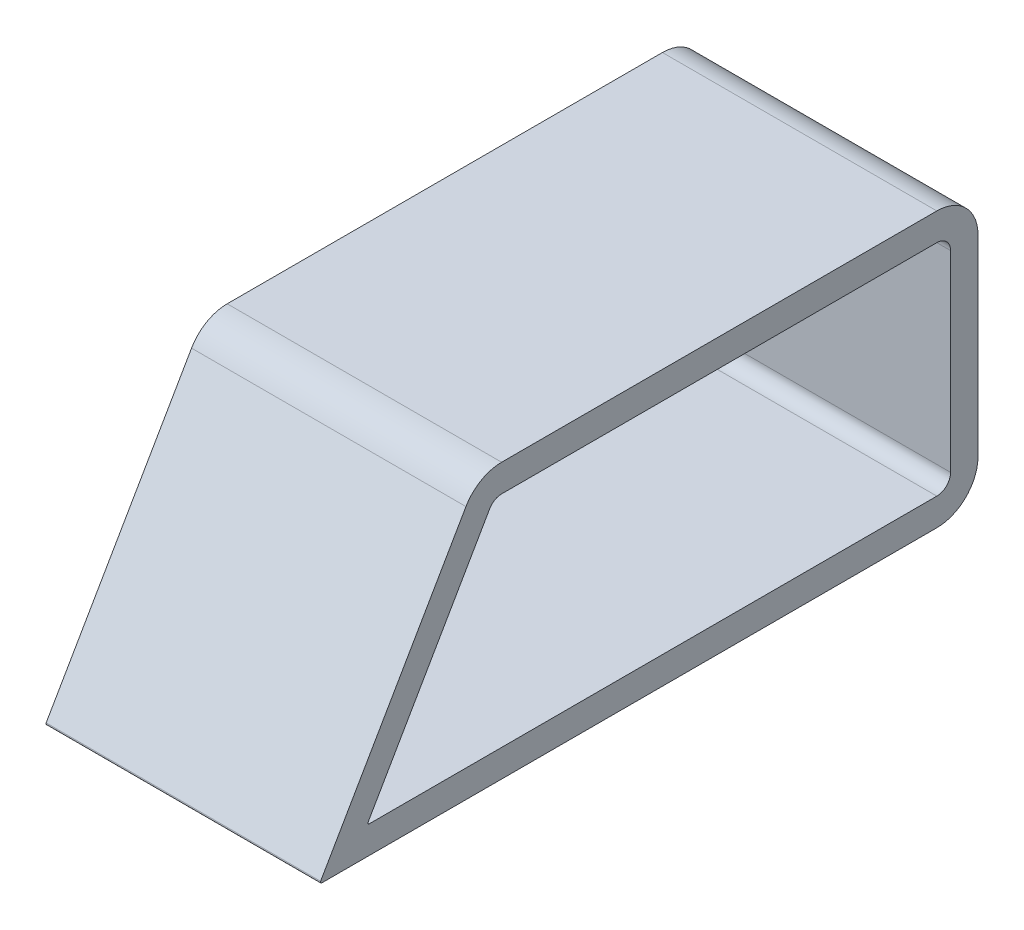
ISO-10303-21;
HEADER;
FILE_DESCRIPTION(('STEP AP214'),'2;1');
FILE_NAME('part.step','',(''),(''),'','','');
FILE_SCHEMA(('AUTOMOTIVE_DESIGN { 1 0 10303 214 1 1 1 1 }'));
ENDSEC;
DATA;
#1=APPLICATION_CONTEXT('core data for automotive mechanical design processes');
#2=APPLICATION_PROTOCOL_DEFINITION('international standard','automotive_design',2000,#1);
#3=PRODUCT_CONTEXT('',#1,'mechanical');
#4=PRODUCT('Part','Part','',(#3));
#5=PRODUCT_RELATED_PRODUCT_CATEGORY('part','',(#4));
#6=PRODUCT_DEFINITION_FORMATION('','',#4);
#7=PRODUCT_DEFINITION_CONTEXT('part definition',#1,'design');
#8=PRODUCT_DEFINITION('design','',#6,#7);
#9=PRODUCT_DEFINITION_SHAPE('','',#8);
#10=(LENGTH_UNIT() NAMED_UNIT(*) SI_UNIT(.MILLI.,.METRE.));
#11=(NAMED_UNIT(*) PLANE_ANGLE_UNIT() SI_UNIT($,.RADIAN.));
#12=(NAMED_UNIT(*) SI_UNIT($,.STERADIAN.) SOLID_ANGLE_UNIT());
#13=UNCERTAINTY_MEASURE_WITH_UNIT(LENGTH_MEASURE(1.E-05),#10,'distance_accuracy_value','');
#14=(GEOMETRIC_REPRESENTATION_CONTEXT(3) GLOBAL_UNCERTAINTY_ASSIGNED_CONTEXT((#13)) GLOBAL_UNIT_ASSIGNED_CONTEXT((#10,
#11,#12)) REPRESENTATION_CONTEXT('',''));
#15=CARTESIAN_POINT('',(0.,0.,0.));
#16=DIRECTION('',(0.,0.,1.));
#17=DIRECTION('',(1.,0.,0.));
#18=AXIS2_PLACEMENT_3D('',#15,#16,#17);
#19=CARTESIAN_POINT('',(254.,431.8,-337.288027260582));
#20=DIRECTION('',(-1.,0.,0.));
#21=DIRECTION('',(0.,0.,1.));
#22=AXIS2_PLACEMENT_3D('',#19,#20,#21);
#23=PLANE('',#22);
#24=DIRECTION('',(0.,-0.866025403784436,0.500000000000004));
#25=VECTOR('',#24,1.);
#26=CARTESIAN_POINT('',(254.,0.,0.));
#27=LINE('',#26,#25);
#28=CARTESIAN_POINT('',(254.,469.9,-271.296891492208));
#29=VERTEX_POINT('',#28);
#30=CARTESIAN_POINT('',(254.,3.81000000000009,-2.19970452561255));
#31=VERTEX_POINT('',#30);
#32=EDGE_CURVE('E263',#29,#31,#27,.T.);
#33=ORIENTED_EDGE('',*,*,#32,.T.);
#34=CARTESIAN_POINT('',(254.,2.54,-4.39940905122516));
#35=DIRECTION('',(-1.,0.,0.));
#36=DIRECTION('',(0.,0.,1.));
#37=AXIS2_PLACEMENT_3D('',#34,#35,#36);
#38=CIRCLE('',#37,2.54);
#39=CARTESIAN_POINT('',(254.,0.,-4.39940905122516));
#40=VERTEX_POINT('',#39);
#41=EDGE_CURVE('E323',#31,#40,#38,.F.);
#42=ORIENTED_EDGE('',*,*,#41,.T.);
#43=DIRECTION('',(0.,0.,-1.));
#44=VECTOR('',#43,1.);
#45=CARTESIAN_POINT('',(254.,0.,-1143.));
#46=LINE('',#45,#44);
#47=CARTESIAN_POINT('',(254.,-1.2490009027033E-13,-1143.));
#48=VERTEX_POINT('',#47);
#49=EDGE_CURVE('E244',#40,#48,#46,.T.);
#50=ORIENTED_EDGE('',*,*,#49,.T.);
#51=CARTESIAN_POINT('',(254.,76.2,-1143.));
#52=DIRECTION('',(1.,0.,0.));
#53=DIRECTION('',(0.,0.,1.));
#54=AXIS2_PLACEMENT_3D('',#51,#52,#53);
#55=CIRCLE('',#54,76.2000000000001);
#56=CARTESIAN_POINT('',(254.,76.2,-1219.2));
#57=VERTEX_POINT('',#56);
#58=EDGE_CURVE('E247',#48,#57,#55,.T.);
#59=ORIENTED_EDGE('',*,*,#58,.T.);
#60=DIRECTION('',(0.,1.,0.));
#61=VECTOR('',#60,1.);
#62=CARTESIAN_POINT('',(254.,431.8,-1219.2));
#63=LINE('',#62,#61);
#64=CARTESIAN_POINT('',(254.,431.8,-1219.2));
#65=VERTEX_POINT('',#64);
#66=EDGE_CURVE('E251',#57,#65,#63,.T.);
#67=ORIENTED_EDGE('',*,*,#66,.T.);
#68=CARTESIAN_POINT('',(254.,431.8,-1143.));
#69=DIRECTION('',(1.,0.,0.));
#70=DIRECTION('',(0.,0.,1.));
#71=AXIS2_PLACEMENT_3D('',#68,#69,#70);
#72=CIRCLE('',#71,76.2000000000001);
#73=CARTESIAN_POINT('',(254.,508.,-1143.));
#74=VERTEX_POINT('',#73);
#75=EDGE_CURVE('E254',#65,#74,#72,.T.);
#76=ORIENTED_EDGE('',*,*,#75,.T.);
#77=DIRECTION('',(0.,0.,1.));
#78=VECTOR('',#77,1.);
#79=CARTESIAN_POINT('',(254.,508.,-337.288027260582));
#80=LINE('',#79,#78);
#81=CARTESIAN_POINT('',(254.,508.,-337.288027260582));
#82=VERTEX_POINT('',#81);
#83=EDGE_CURVE('E257',#74,#82,#80,.T.);
#84=ORIENTED_EDGE('',*,*,#83,.T.);
#85=CARTESIAN_POINT('',(254.,431.8,-337.288027260582));
#86=DIRECTION('',(1.,0.,0.));
#87=DIRECTION('',(0.,0.,1.));
#88=AXIS2_PLACEMENT_3D('',#85,#86,#87);
#89=CIRCLE('',#88,76.1999999999999);
#90=EDGE_CURVE('E260',#82,#29,#89,.T.);
#91=ORIENTED_EDGE('',*,*,#90,.T.);
#92=EDGE_LOOP('',(#33,#42,#50,#59,#67,#76,#84,#91));
#93=FACE_BOUND('',#92,.T.);
#94=CARTESIAN_POINT('',(254.,431.8,-337.288027260582));
#95=DIRECTION('',(1.,0.,0.));
#96=DIRECTION('',(0.,0.,1.));
#97=AXIS2_PLACEMENT_3D('',#94,#95,#96);
#98=CIRCLE('',#97,25.4);
#99=CARTESIAN_POINT('',(254.,457.2,-337.288027260582));
#100=VERTEX_POINT('',#99);
#101=CARTESIAN_POINT('',(254.,444.5,-315.290982004457));
#102=VERTEX_POINT('',#101);
#103=EDGE_CURVE('E161',#100,#102,#98,.T.);
#104=ORIENTED_EDGE('',*,*,#103,.F.);
#105=DIRECTION('',(0.,0.,1.));
#106=VECTOR('',#105,1.);
#107=CARTESIAN_POINT('',(254.,457.2,-337.288027260582));
#108=LINE('',#107,#106);
#109=CARTESIAN_POINT('',(254.,457.2,-1143.));
#110=VERTEX_POINT('',#109);
#111=EDGE_CURVE('E204',#110,#100,#108,.T.);
#112=ORIENTED_EDGE('',*,*,#111,.F.);
#113=CARTESIAN_POINT('',(254.,431.8,-1143.));
#114=DIRECTION('',(1.,0.,0.));
#115=DIRECTION('',(0.,0.,1.));
#116=AXIS2_PLACEMENT_3D('',#113,#114,#115);
#117=CIRCLE('',#116,25.4);
#118=CARTESIAN_POINT('',(254.,431.8,-1168.4));
#119=VERTEX_POINT('',#118);
#120=EDGE_CURVE('E200',#119,#110,#117,.T.);
#121=ORIENTED_EDGE('',*,*,#120,.F.);
#122=DIRECTION('',(0.,1.,0.));
#123=VECTOR('',#122,1.);
#124=CARTESIAN_POINT('',(254.,431.8,-1168.4));
#125=LINE('',#124,#123);
#126=CARTESIAN_POINT('',(254.,76.2,-1168.4));
#127=VERTEX_POINT('',#126);
#128=EDGE_CURVE('E197',#127,#119,#125,.T.);
#129=ORIENTED_EDGE('',*,*,#128,.F.);
#130=CARTESIAN_POINT('',(254.,76.2,-1143.));
#131=DIRECTION('',(1.,0.,0.));
#132=DIRECTION('',(0.,0.,1.));
#133=AXIS2_PLACEMENT_3D('',#130,#131,#132);
#134=CIRCLE('',#133,25.4);
#135=CARTESIAN_POINT('',(254.,50.8,-1143.));
#136=VERTEX_POINT('',#135);
#137=EDGE_CURVE('E192',#136,#127,#134,.T.);
#138=ORIENTED_EDGE('',*,*,#137,.F.);
#139=DIRECTION('',(0.,0.,-1.));
#140=VECTOR('',#139,1.);
#141=CARTESIAN_POINT('',(254.,50.8,-1143.));
#142=LINE('',#141,#140);
#143=CARTESIAN_POINT('',(254.,50.8,-92.3875900757238));
#144=VERTEX_POINT('',#143);
#145=EDGE_CURVE('E189',#144,#136,#142,.T.);
#146=ORIENTED_EDGE('',*,*,#145,.F.);
#147=CARTESIAN_POINT('',(254.,53.34,-92.3875900757239));
#148=DIRECTION('',(-1.,0.,0.));
#149=DIRECTION('',(0.,0.,1.));
#150=AXIS2_PLACEMENT_3D('',#147,#148,#149);
#151=CIRCLE('',#150,2.54);
#152=CARTESIAN_POINT('',(254.,54.61,-90.1878855501115));
#153=VERTEX_POINT('',#152);
#154=EDGE_CURVE('E11',#144,#153,#151,.T.);
#155=ORIENTED_EDGE('',*,*,#154,.T.);
#156=DIRECTION('',(0.,-0.866025403784436,0.500000000000005));
#157=VECTOR('',#156,1.);
#158=CARTESIAN_POINT('',(254.,50.8,-87.988181024499));
#159=LINE('',#158,#157);
#160=EDGE_CURVE('E172',#102,#153,#159,.T.);
#161=ORIENTED_EDGE('',*,*,#160,.F.);
#162=EDGE_LOOP('',(#104,#112,#121,#129,#138,#146,#155,#161));
#163=FACE_BOUND('',#162,.T.);
#164=ADVANCED_FACE('F45',(#93,#163),#23,.F.);
#165=CARTESIAN_POINT('',(-254.,431.8,-337.288027260582));
#166=DIRECTION('',(-1.,0.,0.));
#167=DIRECTION('',(0.,0.,1.));
#168=AXIS2_PLACEMENT_3D('',#165,#166,#167);
#169=PLANE('',#168);
#170=DIRECTION('',(0.,0.,-1.));
#171=VECTOR('',#170,1.);
#172=CARTESIAN_POINT('',(-254.,0.,-1143.));
#173=LINE('',#172,#171);
#174=CARTESIAN_POINT('',(-254.,0.,-4.39940905122516));
#175=VERTEX_POINT('',#174);
#176=CARTESIAN_POINT('',(-254.,-1.2490009027033E-13,-1143.));
#177=VERTEX_POINT('',#176);
#178=EDGE_CURVE('E183',#175,#177,#173,.T.);
#179=ORIENTED_EDGE('',*,*,#178,.F.);
#180=CARTESIAN_POINT('',(-254.,2.54,-4.39940905122516));
#181=DIRECTION('',(-1.,0.,0.));
#182=DIRECTION('',(0.,0.,1.));
#183=AXIS2_PLACEMENT_3D('',#180,#181,#182);
#184=CIRCLE('',#183,2.54);
#185=CARTESIAN_POINT('',(-254.,3.81000000000009,-2.19970452561255));
#186=VERTEX_POINT('',#185);
#187=EDGE_CURVE('E69',#175,#186,#184,.T.);
#188=ORIENTED_EDGE('',*,*,#187,.T.);
#189=DIRECTION('',(0.,-0.866025403784436,0.500000000000004));
#190=VECTOR('',#189,1.);
#191=CARTESIAN_POINT('',(-254.,0.,0.));
#192=LINE('',#191,#190);
#193=CARTESIAN_POINT('',(-254.,469.9,-271.296891492208));
#194=VERTEX_POINT('',#193);
#195=EDGE_CURVE('E248',#194,#186,#192,.T.);
#196=ORIENTED_EDGE('',*,*,#195,.F.);
#197=CARTESIAN_POINT('',(-254.,431.8,-337.288027260582));
#198=DIRECTION('',(1.,0.,0.));
#199=DIRECTION('',(0.,0.,1.));
#200=AXIS2_PLACEMENT_3D('',#197,#198,#199);
#201=CIRCLE('',#200,76.1999999999999);
#202=CARTESIAN_POINT('',(-254.,508.,-337.288027260582));
#203=VERTEX_POINT('',#202);
#204=EDGE_CURVE('E281',#203,#194,#201,.T.);
#205=ORIENTED_EDGE('',*,*,#204,.F.);
#206=DIRECTION('',(0.,0.,1.));
#207=VECTOR('',#206,1.);
#208=CARTESIAN_POINT('',(-254.,508.,-337.288027260582));
#209=LINE('',#208,#207);
#210=CARTESIAN_POINT('',(-254.,508.,-1143.));
#211=VERTEX_POINT('',#210);
#212=EDGE_CURVE('E278',#211,#203,#209,.T.);
#213=ORIENTED_EDGE('',*,*,#212,.F.);
#214=CARTESIAN_POINT('',(-254.,431.8,-1143.));
#215=DIRECTION('',(1.,0.,0.));
#216=DIRECTION('',(0.,0.,1.));
#217=AXIS2_PLACEMENT_3D('',#214,#215,#216);
#218=CIRCLE('',#217,76.2000000000001);
#219=CARTESIAN_POINT('',(-254.,431.8,-1219.2));
#220=VERTEX_POINT('',#219);
#221=EDGE_CURVE('E275',#220,#211,#218,.T.);
#222=ORIENTED_EDGE('',*,*,#221,.F.);
#223=DIRECTION('',(0.,1.,0.));
#224=VECTOR('',#223,1.);
#225=CARTESIAN_POINT('',(-254.,431.8,-1219.2));
#226=LINE('',#225,#224);
#227=CARTESIAN_POINT('',(-254.,76.2,-1219.2));
#228=VERTEX_POINT('',#227);
#229=EDGE_CURVE('E272',#228,#220,#226,.T.);
#230=ORIENTED_EDGE('',*,*,#229,.F.);
#231=CARTESIAN_POINT('',(-254.,76.2,-1143.));
#232=DIRECTION('',(1.,0.,0.));
#233=DIRECTION('',(0.,0.,1.));
#234=AXIS2_PLACEMENT_3D('',#231,#232,#233);
#235=CIRCLE('',#234,76.2000000000001);
#236=EDGE_CURVE('E269',#177,#228,#235,.T.);
#237=ORIENTED_EDGE('',*,*,#236,.F.);
#238=EDGE_LOOP('',(#179,#188,#196,#205,#213,#222,#230,#237));
#239=FACE_BOUND('',#238,.T.);
#240=DIRECTION('',(0.,0.,1.));
#241=VECTOR('',#240,1.);
#242=CARTESIAN_POINT('',(-254.,457.2,-337.288027260582));
#243=LINE('',#242,#241);
#244=CARTESIAN_POINT('',(-254.,457.2,-1143.));
#245=VERTEX_POINT('',#244);
#246=CARTESIAN_POINT('',(-254.,457.2,-337.288027260582));
#247=VERTEX_POINT('',#246);
#248=EDGE_CURVE('E173',#245,#247,#243,.T.);
#249=ORIENTED_EDGE('',*,*,#248,.T.);
#250=CARTESIAN_POINT('',(-254.,431.8,-337.288027260582));
#251=DIRECTION('',(1.,0.,0.));
#252=DIRECTION('',(0.,0.,1.));
#253=AXIS2_PLACEMENT_3D('',#250,#251,#252);
#254=CIRCLE('',#253,25.4);
#255=CARTESIAN_POINT('',(-254.,444.5,-315.290982004457));
#256=VERTEX_POINT('',#255);
#257=EDGE_CURVE('E207',#247,#256,#254,.T.);
#258=ORIENTED_EDGE('',*,*,#257,.T.);
#259=DIRECTION('',(0.,-0.866025403784436,0.500000000000005));
#260=VECTOR('',#259,1.);
#261=CARTESIAN_POINT('',(-254.,50.8,-87.988181024499));
#262=LINE('',#261,#260);
#263=CARTESIAN_POINT('',(-254.,54.61,-90.1878855501115));
#264=VERTEX_POINT('',#263);
#265=EDGE_CURVE('E181',#256,#264,#262,.T.);
#266=ORIENTED_EDGE('',*,*,#265,.T.);
#267=CARTESIAN_POINT('',(-254.,53.34,-92.3875900757239));
#268=DIRECTION('',(-1.,0.,0.));
#269=DIRECTION('',(0.,0.,1.));
#270=AXIS2_PLACEMENT_3D('',#267,#268,#269);
#271=CIRCLE('',#270,2.54);
#272=CARTESIAN_POINT('',(-254.,50.8,-92.3875900757238));
#273=VERTEX_POINT('',#272);
#274=EDGE_CURVE('E54',#264,#273,#271,.F.);
#275=ORIENTED_EDGE('',*,*,#274,.T.);
#276=DIRECTION('',(0.,0.,-1.));
#277=VECTOR('',#276,1.);
#278=CARTESIAN_POINT('',(-254.,50.8,-1143.));
#279=LINE('',#278,#277);
#280=CARTESIAN_POINT('',(-254.,50.8,-1143.));
#281=VERTEX_POINT('',#280);
#282=EDGE_CURVE('E212',#273,#281,#279,.T.);
#283=ORIENTED_EDGE('',*,*,#282,.T.);
#284=CARTESIAN_POINT('',(-254.,76.2,-1143.));
#285=DIRECTION('',(1.,0.,0.));
#286=DIRECTION('',(0.,0.,1.));
#287=AXIS2_PLACEMENT_3D('',#284,#285,#286);
#288=CIRCLE('',#287,25.4);
#289=CARTESIAN_POINT('',(-254.,76.2,-1168.4));
#290=VERTEX_POINT('',#289);
#291=EDGE_CURVE('E215',#281,#290,#288,.T.);
#292=ORIENTED_EDGE('',*,*,#291,.T.);
#293=DIRECTION('',(0.,1.,0.));
#294=VECTOR('',#293,1.);
#295=CARTESIAN_POINT('',(-254.,431.8,-1168.4));
#296=LINE('',#295,#294);
#297=CARTESIAN_POINT('',(-254.,431.8,-1168.4));
#298=VERTEX_POINT('',#297);
#299=EDGE_CURVE('E219',#290,#298,#296,.T.);
#300=ORIENTED_EDGE('',*,*,#299,.T.);
#301=CARTESIAN_POINT('',(-254.,431.8,-1143.));
#302=DIRECTION('',(1.,0.,0.));
#303=DIRECTION('',(0.,0.,1.));
#304=AXIS2_PLACEMENT_3D('',#301,#302,#303);
#305=CIRCLE('',#304,25.4);
#306=EDGE_CURVE('E223',#298,#245,#305,.T.);
#307=ORIENTED_EDGE('',*,*,#306,.T.);
#308=EDGE_LOOP('',(#249,#258,#266,#275,#283,#292,#300,#307));
#309=FACE_BOUND('',#308,.T.);
#310=ADVANCED_FACE('F328',(#239,#309),#169,.T.);
#311=CARTESIAN_POINT('',(254.,0.,-1143.));
#312=DIRECTION('',(0.,1.,0.));
#313=DIRECTION('',(0.,0.,1.));
#314=AXIS2_PLACEMENT_3D('',#311,#312,#313);
#315=PLANE('',#314);
#316=ORIENTED_EDGE('',*,*,#49,.F.);
#317=DIRECTION('',(-1.,0.,0.));
#318=VECTOR('',#317,1.);
#319=CARTESIAN_POINT('',(254.,0.,-4.39940905122516));
#320=LINE('',#319,#318);
#321=EDGE_CURVE('E315',#40,#175,#320,.T.);
#322=ORIENTED_EDGE('',*,*,#321,.T.);
#323=ORIENTED_EDGE('',*,*,#178,.T.);
#324=DIRECTION('',(-1.,0.,0.));
#325=VECTOR('',#324,1.);
#326=CARTESIAN_POINT('',(254.,-1.2490009027033E-13,-1143.));
#327=LINE('',#326,#325);
#328=EDGE_CURVE('E305',#48,#177,#327,.T.);
#329=ORIENTED_EDGE('',*,*,#328,.F.);
#330=EDGE_LOOP('',(#316,#322,#323,#329));
#331=FACE_BOUND('',#330,.T.);
#332=ADVANCED_FACE('F354',(#331),#315,.F.);
#333=CARTESIAN_POINT('',(254.,76.2,-1143.));
#334=DIRECTION('',(-1.,0.,0.));
#335=DIRECTION('',(0.,0.,1.));
#336=AXIS2_PLACEMENT_3D('',#333,#334,#335);
#337=CYLINDRICAL_SURFACE('',#336,76.2000000000001);
#338=ORIENTED_EDGE('',*,*,#236,.T.);
#339=DIRECTION('',(-1.,0.,0.));
#340=VECTOR('',#339,1.);
#341=CARTESIAN_POINT('',(254.,76.2,-1219.2));
#342=LINE('',#341,#340);
#343=EDGE_CURVE('E301',#57,#228,#342,.T.);
#344=ORIENTED_EDGE('',*,*,#343,.F.);
#345=ORIENTED_EDGE('',*,*,#58,.F.);
#346=ORIENTED_EDGE('',*,*,#328,.T.);
#347=EDGE_LOOP('',(#338,#344,#345,#346));
#348=FACE_BOUND('',#347,.T.);
#349=ADVANCED_FACE('F377',(#348),#337,.T.);
#350=CARTESIAN_POINT('',(254.,431.8,-1219.2));
#351=DIRECTION('',(0.,0.,1.));
#352=DIRECTION('',(1.,0.,0.));
#353=AXIS2_PLACEMENT_3D('',#350,#351,#352);
#354=PLANE('',#353);
#355=ORIENTED_EDGE('',*,*,#229,.T.);
#356=DIRECTION('',(-1.,0.,0.));
#357=VECTOR('',#356,1.);
#358=CARTESIAN_POINT('',(254.,431.8,-1219.2));
#359=LINE('',#358,#357);
#360=EDGE_CURVE('E297',#65,#220,#359,.T.);
#361=ORIENTED_EDGE('',*,*,#360,.F.);
#362=ORIENTED_EDGE('',*,*,#66,.F.);
#363=ORIENTED_EDGE('',*,*,#343,.T.);
#364=EDGE_LOOP('',(#355,#361,#362,#363));
#365=FACE_BOUND('',#364,.T.);
#366=ADVANCED_FACE('F373',(#365),#354,.F.);
#367=CARTESIAN_POINT('',(254.,431.8,-1143.));
#368=DIRECTION('',(-1.,0.,0.));
#369=DIRECTION('',(0.,0.,1.));
#370=AXIS2_PLACEMENT_3D('',#367,#368,#369);
#371=CYLINDRICAL_SURFACE('',#370,76.2000000000001);
#372=ORIENTED_EDGE('',*,*,#221,.T.);
#373=DIRECTION('',(-1.,0.,0.));
#374=VECTOR('',#373,1.);
#375=CARTESIAN_POINT('',(254.,508.,-1143.));
#376=LINE('',#375,#374);
#377=EDGE_CURVE('E293',#74,#211,#376,.T.);
#378=ORIENTED_EDGE('',*,*,#377,.F.);
#379=ORIENTED_EDGE('',*,*,#75,.F.);
#380=ORIENTED_EDGE('',*,*,#360,.T.);
#381=EDGE_LOOP('',(#372,#378,#379,#380));
#382=FACE_BOUND('',#381,.T.);
#383=ADVANCED_FACE('F369',(#382),#371,.T.);
#384=CARTESIAN_POINT('',(254.,508.,-337.288027260582));
#385=DIRECTION('',(0.,-1.,0.));
#386=DIRECTION('',(0.,0.,-1.));
#387=AXIS2_PLACEMENT_3D('',#384,#385,#386);
#388=PLANE('',#387);
#389=ORIENTED_EDGE('',*,*,#212,.T.);
#390=DIRECTION('',(-1.,0.,0.));
#391=VECTOR('',#390,1.);
#392=CARTESIAN_POINT('',(254.,508.,-337.288027260582));
#393=LINE('',#392,#391);
#394=EDGE_CURVE('E289',#82,#203,#393,.T.);
#395=ORIENTED_EDGE('',*,*,#394,.F.);
#396=ORIENTED_EDGE('',*,*,#83,.F.);
#397=ORIENTED_EDGE('',*,*,#377,.T.);
#398=EDGE_LOOP('',(#389,#395,#396,#397));
#399=FACE_BOUND('',#398,.T.);
#400=ADVANCED_FACE('F365',(#399),#388,.F.);
#401=CARTESIAN_POINT('',(254.,431.8,-337.288027260582));
#402=DIRECTION('',(-1.,0.,0.));
#403=DIRECTION('',(0.,0.,1.));
#404=AXIS2_PLACEMENT_3D('',#401,#402,#403);
#405=CYLINDRICAL_SURFACE('',#404,76.1999999999999);
#406=ORIENTED_EDGE('',*,*,#204,.T.);
#407=DIRECTION('',(-1.,0.,0.));
#408=VECTOR('',#407,1.);
#409=CARTESIAN_POINT('',(254.,469.9,-271.296891492208));
#410=LINE('',#409,#408);
#411=EDGE_CURVE('E266',#29,#194,#410,.T.);
#412=ORIENTED_EDGE('',*,*,#411,.F.);
#413=ORIENTED_EDGE('',*,*,#90,.F.);
#414=ORIENTED_EDGE('',*,*,#394,.T.);
#415=EDGE_LOOP('',(#406,#412,#413,#414));
#416=FACE_BOUND('',#415,.T.);
#417=ADVANCED_FACE('F362',(#416),#405,.T.);
#418=CARTESIAN_POINT('',(254.,0.,0.));
#419=DIRECTION('',(0.,-0.500000000000004,-0.866025403784436));
#420=DIRECTION('',(0.,0.866025403784436,-0.500000000000004));
#421=AXIS2_PLACEMENT_3D('',#418,#419,#420);
#422=PLANE('',#421);
#423=ORIENTED_EDGE('',*,*,#195,.T.);
#424=DIRECTION('',(-1.,0.,0.));
#425=VECTOR('',#424,1.);
#426=CARTESIAN_POINT('',(254.,3.81000000000009,-2.19970452561255));
#427=LINE('',#426,#425);
#428=EDGE_CURVE('E61',#186,#31,#427,.F.);
#429=ORIENTED_EDGE('',*,*,#428,.T.);
#430=ORIENTED_EDGE('',*,*,#32,.F.);
#431=ORIENTED_EDGE('',*,*,#411,.T.);
#432=EDGE_LOOP('',(#423,#429,#430,#431));
#433=FACE_BOUND('',#432,.T.);
#434=ADVANCED_FACE('F359',(#433),#422,.F.);
#435=CARTESIAN_POINT('',(254.,431.8,-337.288027260582));
#436=DIRECTION('',(-1.,0.,0.));
#437=DIRECTION('',(0.,0.,1.));
#438=AXIS2_PLACEMENT_3D('',#435,#436,#437);
#439=CYLINDRICAL_SURFACE('',#438,25.4);
#440=ORIENTED_EDGE('',*,*,#257,.F.);
#441=DIRECTION('',(-1.,0.,0.));
#442=VECTOR('',#441,1.);
#443=CARTESIAN_POINT('',(254.,457.2,-337.288027260582));
#444=LINE('',#443,#442);
#445=EDGE_CURVE('E167',#100,#247,#444,.T.);
#446=ORIENTED_EDGE('',*,*,#445,.F.);
#447=ORIENTED_EDGE('',*,*,#103,.T.);
#448=DIRECTION('',(-1.,0.,0.));
#449=VECTOR('',#448,1.);
#450=CARTESIAN_POINT('',(254.,444.5,-315.290982004457));
#451=LINE('',#450,#449);
#452=EDGE_CURVE('E164',#102,#256,#451,.T.);
#453=ORIENTED_EDGE('',*,*,#452,.T.);
#454=EDGE_LOOP('',(#440,#446,#447,#453));
#455=FACE_BOUND('',#454,.T.);
#456=ADVANCED_FACE('F163',(#455),#439,.F.);
#457=CARTESIAN_POINT('',(254.,50.8,-87.988181024499));
#458=DIRECTION('',(0.,-0.500000000000005,-0.866025403784436));
#459=DIRECTION('',(0.,0.866025403784436,-0.500000000000005));
#460=AXIS2_PLACEMENT_3D('',#457,#458,#459);
#461=PLANE('',#460);
#462=ORIENTED_EDGE('',*,*,#160,.T.);
#463=DIRECTION('',(-1.,0.,0.));
#464=VECTOR('',#463,1.);
#465=CARTESIAN_POINT('',(-254.,54.61,-90.1878855501115));
#466=LINE('',#465,#464);
#467=EDGE_CURVE('E309',#153,#264,#466,.T.);
#468=ORIENTED_EDGE('',*,*,#467,.T.);
#469=ORIENTED_EDGE('',*,*,#265,.F.);
#470=ORIENTED_EDGE('',*,*,#452,.F.);
#471=EDGE_LOOP('',(#462,#468,#469,#470));
#472=FACE_BOUND('',#471,.T.);
#473=ADVANCED_FACE('F177',(#472),#461,.T.);
#474=CARTESIAN_POINT('',(254.,50.8,-1143.));
#475=DIRECTION('',(0.,1.,0.));
#476=DIRECTION('',(0.,0.,1.));
#477=AXIS2_PLACEMENT_3D('',#474,#475,#476);
#478=PLANE('',#477);
#479=ORIENTED_EDGE('',*,*,#282,.F.);
#480=DIRECTION('',(-1.,0.,0.));
#481=VECTOR('',#480,1.);
#482=CARTESIAN_POINT('',(254.,50.8,-92.3875900757239));
#483=LINE('',#482,#481);
#484=EDGE_CURVE('E312',#273,#144,#483,.F.);
#485=ORIENTED_EDGE('',*,*,#484,.T.);
#486=ORIENTED_EDGE('',*,*,#145,.T.);
#487=DIRECTION('',(-1.,0.,0.));
#488=VECTOR('',#487,1.);
#489=CARTESIAN_POINT('',(254.,50.8,-1143.));
#490=LINE('',#489,#488);
#491=EDGE_CURVE('E184',#136,#281,#490,.T.);
#492=ORIENTED_EDGE('',*,*,#491,.T.);
#493=EDGE_LOOP('',(#479,#485,#486,#492));
#494=FACE_BOUND('',#493,.T.);
#495=ADVANCED_FACE('F332',(#494),#478,.T.);
#496=CARTESIAN_POINT('',(254.,76.2,-1143.));
#497=DIRECTION('',(-1.,0.,0.));
#498=DIRECTION('',(0.,0.,1.));
#499=AXIS2_PLACEMENT_3D('',#496,#497,#498);
#500=CYLINDRICAL_SURFACE('',#499,25.4);
#501=ORIENTED_EDGE('',*,*,#291,.F.);
#502=ORIENTED_EDGE('',*,*,#491,.F.);
#503=ORIENTED_EDGE('',*,*,#137,.T.);
#504=DIRECTION('',(-1.,0.,0.));
#505=VECTOR('',#504,1.);
#506=CARTESIAN_POINT('',(254.,76.2,-1168.4));
#507=LINE('',#506,#505);
#508=EDGE_CURVE('E238',#127,#290,#507,.T.);
#509=ORIENTED_EDGE('',*,*,#508,.T.);
#510=EDGE_LOOP('',(#501,#502,#503,#509));
#511=FACE_BOUND('',#510,.T.);
#512=ADVANCED_FACE('F425',(#511),#500,.F.);
#513=CARTESIAN_POINT('',(254.,431.8,-1168.4));
#514=DIRECTION('',(0.,0.,1.));
#515=DIRECTION('',(1.,0.,0.));
#516=AXIS2_PLACEMENT_3D('',#513,#514,#515);
#517=PLANE('',#516);
#518=ORIENTED_EDGE('',*,*,#299,.F.);
#519=ORIENTED_EDGE('',*,*,#508,.F.);
#520=ORIENTED_EDGE('',*,*,#128,.T.);
#521=DIRECTION('',(-1.,0.,0.));
#522=VECTOR('',#521,1.);
#523=CARTESIAN_POINT('',(254.,431.8,-1168.4));
#524=LINE('',#523,#522);
#525=EDGE_CURVE('E235',#119,#298,#524,.T.);
#526=ORIENTED_EDGE('',*,*,#525,.T.);
#527=EDGE_LOOP('',(#518,#519,#520,#526));
#528=FACE_BOUND('',#527,.T.);
#529=ADVANCED_FACE('F437',(#528),#517,.T.);
#530=CARTESIAN_POINT('',(254.,431.8,-1143.));
#531=DIRECTION('',(-1.,0.,0.));
#532=DIRECTION('',(0.,0.,1.));
#533=AXIS2_PLACEMENT_3D('',#530,#531,#532);
#534=CYLINDRICAL_SURFACE('',#533,25.4);
#535=ORIENTED_EDGE('',*,*,#306,.F.);
#536=ORIENTED_EDGE('',*,*,#525,.F.);
#537=ORIENTED_EDGE('',*,*,#120,.T.);
#538=DIRECTION('',(-1.,0.,0.));
#539=VECTOR('',#538,1.);
#540=CARTESIAN_POINT('',(254.,457.2,-1143.));
#541=LINE('',#540,#539);
#542=EDGE_CURVE('E232',#110,#245,#541,.T.);
#543=ORIENTED_EDGE('',*,*,#542,.T.);
#544=EDGE_LOOP('',(#535,#536,#537,#543));
#545=FACE_BOUND('',#544,.T.);
#546=ADVANCED_FACE('F344',(#545),#534,.F.);
#547=CARTESIAN_POINT('',(254.,457.2,-337.288027260582));
#548=DIRECTION('',(0.,-1.,0.));
#549=DIRECTION('',(0.,0.,-1.));
#550=AXIS2_PLACEMENT_3D('',#547,#548,#549);
#551=PLANE('',#550);
#552=ORIENTED_EDGE('',*,*,#248,.F.);
#553=ORIENTED_EDGE('',*,*,#542,.F.);
#554=ORIENTED_EDGE('',*,*,#111,.T.);
#555=ORIENTED_EDGE('',*,*,#445,.T.);
#556=EDGE_LOOP('',(#552,#553,#554,#555));
#557=FACE_BOUND('',#556,.T.);
#558=ADVANCED_FACE('F337',(#557),#551,.T.);
#559=CARTESIAN_POINT('',(254.,53.34,-92.3875900757239));
#560=DIRECTION('',(1.,0.,0.));
#561=DIRECTION('',(0.,0.,-1.));
#562=AXIS2_PLACEMENT_3D('',#559,#560,#561);
#563=CYLINDRICAL_SURFACE('',#562,2.54);
#564=ORIENTED_EDGE('',*,*,#154,.F.);
#565=ORIENTED_EDGE('',*,*,#484,.F.);
#566=ORIENTED_EDGE('',*,*,#274,.F.);
#567=ORIENTED_EDGE('',*,*,#467,.F.);
#568=EDGE_LOOP('',(#564,#565,#566,#567));
#569=FACE_BOUND('',#568,.T.);
#570=ADVANCED_FACE('F335',(#569),#563,.F.);
#571=CARTESIAN_POINT('',(254.,2.54,-4.39940905122516));
#572=DIRECTION('',(-1.,0.,0.));
#573=DIRECTION('',(0.,0.,1.));
#574=AXIS2_PLACEMENT_3D('',#571,#572,#573);
#575=CYLINDRICAL_SURFACE('',#574,2.54);
#576=ORIENTED_EDGE('',*,*,#41,.F.);
#577=ORIENTED_EDGE('',*,*,#428,.F.);
#578=ORIENTED_EDGE('',*,*,#187,.F.);
#579=ORIENTED_EDGE('',*,*,#321,.F.);
#580=EDGE_LOOP('',(#576,#577,#578,#579));
#581=FACE_BOUND('',#580,.T.);
#582=ADVANCED_FACE('F47',(#581),#575,.T.);
#583=CLOSED_SHELL('',(#164,#310,#332,#349,#366,#383,#400,#417,#434,#456,#473,#495,#512,#529,
#546,#558,#570,#582));
#584=MANIFOLD_SOLID_BREP('B2',#583);
#585=ADVANCED_BREP_SHAPE_REPRESENTATION('',(#18,#584),#14);
#586=SHAPE_DEFINITION_REPRESENTATION(#9,#585);
ENDSEC;
END-ISO-10303-21;
